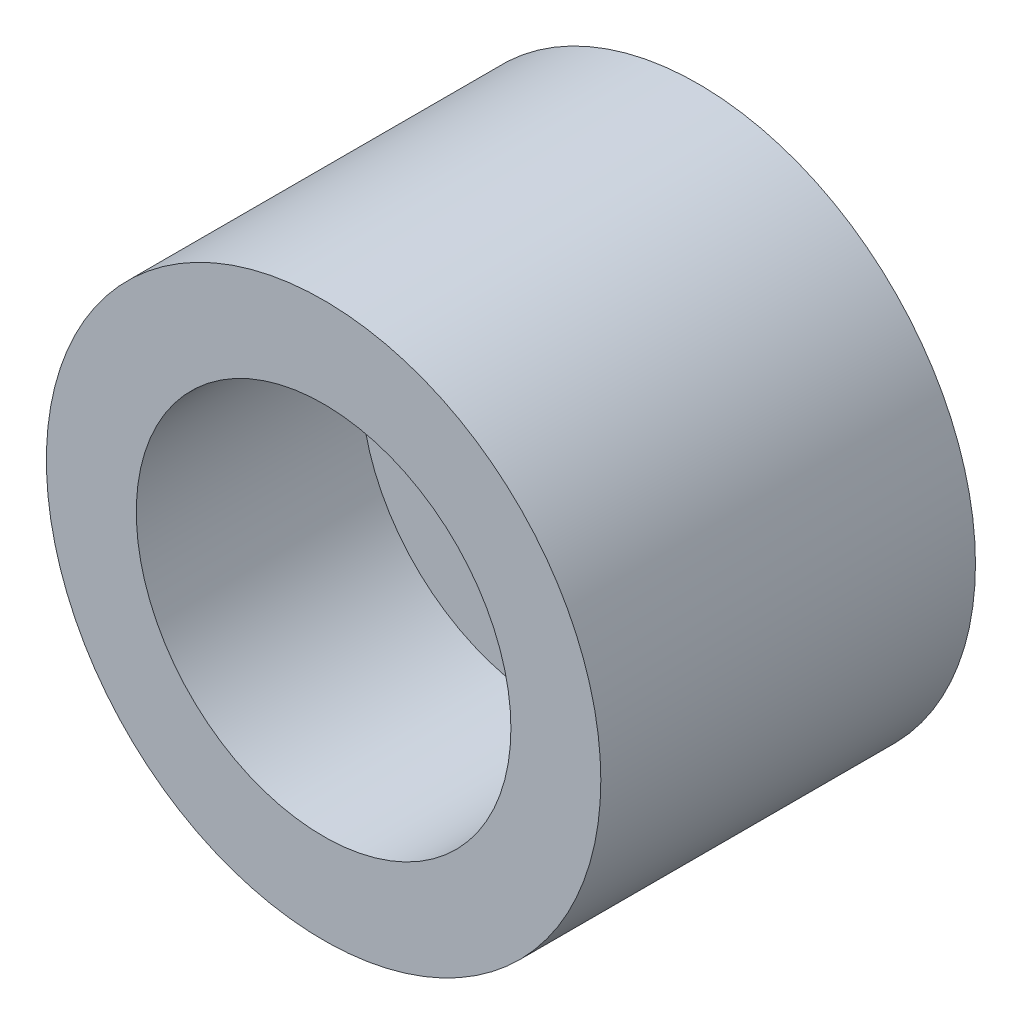
ISO-10303-21;
HEADER;
FILE_DESCRIPTION(('STEP AP214'),'2;1');
FILE_NAME('part.step','',(''),(''),'','','');
FILE_SCHEMA(('AUTOMOTIVE_DESIGN { 1 0 10303 214 1 1 1 1 }'));
ENDSEC;
DATA;
#1=APPLICATION_CONTEXT('core data for automotive mechanical design processes');
#2=APPLICATION_PROTOCOL_DEFINITION('international standard','automotive_design',2000,#1);
#3=PRODUCT_CONTEXT('',#1,'mechanical');
#4=PRODUCT('Part','Part','',(#3));
#5=PRODUCT_RELATED_PRODUCT_CATEGORY('part','',(#4));
#6=PRODUCT_DEFINITION_FORMATION('','',#4);
#7=PRODUCT_DEFINITION_CONTEXT('part definition',#1,'design');
#8=PRODUCT_DEFINITION('design','',#6,#7);
#9=PRODUCT_DEFINITION_SHAPE('','',#8);
#10=(LENGTH_UNIT() NAMED_UNIT(*) SI_UNIT(.MILLI.,.METRE.));
#11=(NAMED_UNIT(*) PLANE_ANGLE_UNIT() SI_UNIT($,.RADIAN.));
#12=(NAMED_UNIT(*) SI_UNIT($,.STERADIAN.) SOLID_ANGLE_UNIT());
#13=UNCERTAINTY_MEASURE_WITH_UNIT(LENGTH_MEASURE(1.E-05),#10,'distance_accuracy_value','');
#14=(GEOMETRIC_REPRESENTATION_CONTEXT(3) GLOBAL_UNCERTAINTY_ASSIGNED_CONTEXT((#13)) GLOBAL_UNIT_ASSIGNED_CONTEXT((#10,
#11,#12)) REPRESENTATION_CONTEXT('',''));
#15=CARTESIAN_POINT('',(0.,0.,0.));
#16=DIRECTION('',(0.,0.,1.));
#17=DIRECTION('',(1.,0.,0.));
#18=AXIS2_PLACEMENT_3D('',#15,#16,#17);
#19=CARTESIAN_POINT('',(0.,0.,5.));
#20=DIRECTION('',(0.,0.,-1.));
#21=DIRECTION('',(-1.,0.,0.));
#22=AXIS2_PLACEMENT_3D('',#19,#20,#21);
#23=CYLINDRICAL_SURFACE('',#22,3.7);
#24=CARTESIAN_POINT('',(0.,0.,5.));
#25=DIRECTION('',(0.,0.,1.));
#26=DIRECTION('',(1.,0.,0.));
#27=AXIS2_PLACEMENT_3D('',#24,#25,#26);
#28=CIRCLE('',#27,3.7);
#29=CARTESIAN_POINT('',(3.7,0.,5.));
#30=VERTEX_POINT('',#29);
#31=EDGE_CURVE('E10',#30,#30,#28,.T.);
#32=ORIENTED_EDGE('',*,*,#31,.F.);
#33=EDGE_LOOP('',(#32));
#34=FACE_BOUND('',#33,.T.);
#35=CARTESIAN_POINT('',(0.,0.,0.));
#36=DIRECTION('',(0.,0.,1.));
#37=DIRECTION('',(1.,0.,0.));
#38=AXIS2_PLACEMENT_3D('',#35,#36,#37);
#39=CIRCLE('',#38,3.7);
#40=CARTESIAN_POINT('',(3.7,0.,0.));
#41=VERTEX_POINT('',#40);
#42=EDGE_CURVE('E48',#41,#41,#39,.T.);
#43=ORIENTED_EDGE('',*,*,#42,.T.);
#44=EDGE_LOOP('',(#43));
#45=FACE_BOUND('',#44,.T.);
#46=ADVANCED_FACE('F45',(#34,#45),#23,.T.);
#47=CARTESIAN_POINT('',(0.,0.,5.));
#48=DIRECTION('',(0.,0.,1.));
#49=DIRECTION('',(1.,0.,0.));
#50=AXIS2_PLACEMENT_3D('',#47,#48,#49);
#51=PLANE('',#50);
#52=CARTESIAN_POINT('',(0.,0.,5.));
#53=DIRECTION('',(0.,0.,1.));
#54=DIRECTION('',(1.,0.,0.));
#55=AXIS2_PLACEMENT_3D('',#52,#53,#54);
#56=CIRCLE('',#55,2.5);
#57=CARTESIAN_POINT('',(2.5,0.,5.));
#58=VERTEX_POINT('',#57);
#59=EDGE_CURVE('E57',#58,#58,#56,.T.);
#60=ORIENTED_EDGE('',*,*,#59,.F.);
#61=EDGE_LOOP('',(#60));
#62=FACE_BOUND('',#61,.T.);
#63=ORIENTED_EDGE('',*,*,#31,.T.);
#64=EDGE_LOOP('',(#63));
#65=FACE_BOUND('',#64,.T.);
#66=ADVANCED_FACE('F90',(#62,#65),#51,.T.);
#67=CARTESIAN_POINT('',(0.,0.,0.));
#68=DIRECTION('',(0.,0.,1.));
#69=DIRECTION('',(1.,0.,0.));
#70=AXIS2_PLACEMENT_3D('',#67,#68,#69);
#71=PLANE('',#70);
#72=CARTESIAN_POINT('',(0.,0.,0.));
#73=DIRECTION('',(0.,0.,1.));
#74=DIRECTION('',(1.,0.,0.));
#75=AXIS2_PLACEMENT_3D('',#72,#73,#74);
#76=CIRCLE('',#75,1.5);
#77=CARTESIAN_POINT('',(1.5,0.,0.));
#78=VERTEX_POINT('',#77);
#79=EDGE_CURVE('E60',#78,#78,#76,.T.);
#80=ORIENTED_EDGE('',*,*,#79,.T.);
#81=EDGE_LOOP('',(#80));
#82=FACE_BOUND('',#81,.T.);
#83=ORIENTED_EDGE('',*,*,#42,.F.);
#84=EDGE_LOOP('',(#83));
#85=FACE_BOUND('',#84,.T.);
#86=ADVANCED_FACE('F69',(#82,#85),#71,.F.);
#87=CARTESIAN_POINT('',(0.,0.,2.));
#88=DIRECTION('',(0.,0.,1.));
#89=DIRECTION('',(1.,0.,0.));
#90=AXIS2_PLACEMENT_3D('',#87,#88,#89);
#91=CYLINDRICAL_SURFACE('',#90,2.5);
#92=CARTESIAN_POINT('',(0.,0.,2.));
#93=DIRECTION('',(0.,0.,1.));
#94=DIRECTION('',(1.,0.,0.));
#95=AXIS2_PLACEMENT_3D('',#92,#93,#94);
#96=CIRCLE('',#95,2.5);
#97=CARTESIAN_POINT('',(2.5,0.,2.));
#98=VERTEX_POINT('',#97);
#99=EDGE_CURVE('E55',#98,#98,#96,.T.);
#100=ORIENTED_EDGE('',*,*,#99,.F.);
#101=EDGE_LOOP('',(#100));
#102=FACE_BOUND('',#101,.T.);
#103=ORIENTED_EDGE('',*,*,#59,.T.);
#104=EDGE_LOOP('',(#103));
#105=FACE_BOUND('',#104,.T.);
#106=ADVANCED_FACE('F81',(#102,#105),#91,.F.);
#107=CARTESIAN_POINT('',(0.,0.,2.));
#108=DIRECTION('',(0.,0.,1.));
#109=DIRECTION('',(1.,0.,0.));
#110=AXIS2_PLACEMENT_3D('',#107,#108,#109);
#111=PLANE('',#110);
#112=CARTESIAN_POINT('',(0.,0.,2.));
#113=DIRECTION('',(0.,0.,1.));
#114=DIRECTION('',(1.,0.,0.));
#115=AXIS2_PLACEMENT_3D('',#112,#113,#114);
#116=CIRCLE('',#115,1.5);
#117=CARTESIAN_POINT('',(1.5,0.,2.));
#118=VERTEX_POINT('',#117);
#119=EDGE_CURVE('E63',#118,#118,#116,.T.);
#120=ORIENTED_EDGE('',*,*,#119,.F.);
#121=EDGE_LOOP('',(#120));
#122=FACE_BOUND('',#121,.T.);
#123=ORIENTED_EDGE('',*,*,#99,.T.);
#124=EDGE_LOOP('',(#123));
#125=FACE_BOUND('',#124,.T.);
#126=ADVANCED_FACE('F75',(#122,#125),#111,.T.);
#127=CARTESIAN_POINT('',(0.,0.,0.));
#128=DIRECTION('',(0.,0.,1.));
#129=DIRECTION('',(1.,0.,0.));
#130=AXIS2_PLACEMENT_3D('',#127,#128,#129);
#131=CYLINDRICAL_SURFACE('',#130,1.5);
#132=ORIENTED_EDGE('',*,*,#79,.F.);
#133=EDGE_LOOP('',(#132));
#134=FACE_BOUND('',#133,.T.);
#135=ORIENTED_EDGE('',*,*,#119,.T.);
#136=EDGE_LOOP('',(#135));
#137=FACE_BOUND('',#136,.T.);
#138=ADVANCED_FACE('F72',(#134,#137),#131,.F.);
#139=CLOSED_SHELL('',(#46,#66,#86,#106,#126,#138));
#140=MANIFOLD_SOLID_BREP('B2',#139);
#141=ADVANCED_BREP_SHAPE_REPRESENTATION('',(#18,#140),#14);
#142=SHAPE_DEFINITION_REPRESENTATION(#9,#141);
ENDSEC;
END-ISO-10303-21;
